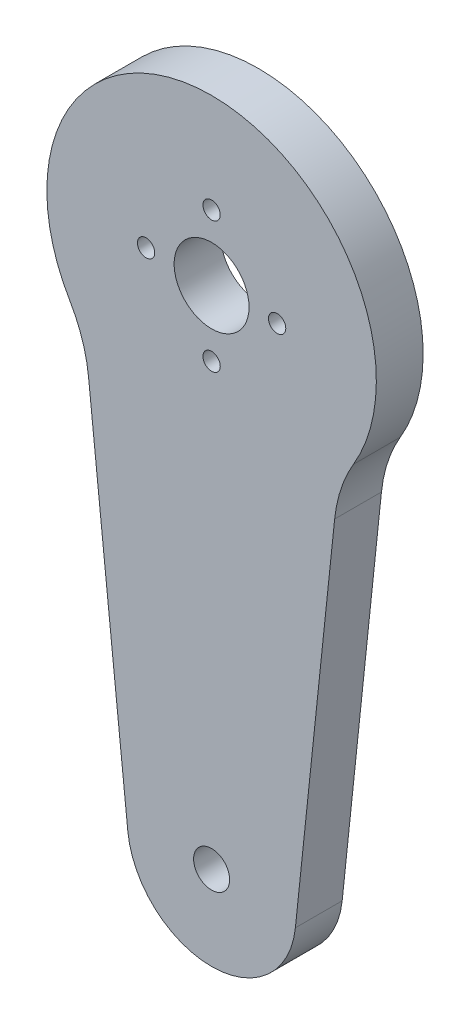
ISO-10303-21;
HEADER;
FILE_DESCRIPTION(('STEP AP214'),'2;1');
FILE_NAME('part.step','',(''),(''),'','','');
FILE_SCHEMA(('AUTOMOTIVE_DESIGN { 1 0 10303 214 1 1 1 1 }'));
ENDSEC;
DATA;
#1=APPLICATION_CONTEXT('core data for automotive mechanical design processes');
#2=APPLICATION_PROTOCOL_DEFINITION('international standard','automotive_design',2000,#1);
#3=PRODUCT_CONTEXT('',#1,'mechanical');
#4=PRODUCT('Part','Part','',(#3));
#5=PRODUCT_RELATED_PRODUCT_CATEGORY('part','',(#4));
#6=PRODUCT_DEFINITION_FORMATION('','',#4);
#7=PRODUCT_DEFINITION_CONTEXT('part definition',#1,'design');
#8=PRODUCT_DEFINITION('design','',#6,#7);
#9=PRODUCT_DEFINITION_SHAPE('','',#8);
#10=(LENGTH_UNIT() NAMED_UNIT(*) SI_UNIT(.MILLI.,.METRE.));
#11=(NAMED_UNIT(*) PLANE_ANGLE_UNIT() SI_UNIT($,.RADIAN.));
#12=(NAMED_UNIT(*) SI_UNIT($,.STERADIAN.) SOLID_ANGLE_UNIT());
#13=UNCERTAINTY_MEASURE_WITH_UNIT(LENGTH_MEASURE(1.E-05),#10,'distance_accuracy_value','');
#14=(GEOMETRIC_REPRESENTATION_CONTEXT(3) GLOBAL_UNCERTAINTY_ASSIGNED_CONTEXT((#13)) GLOBAL_UNIT_ASSIGNED_CONTEXT((#10,
#11,#12)) REPRESENTATION_CONTEXT('',''));
#15=CARTESIAN_POINT('',(0.,0.,0.));
#16=DIRECTION('',(0.,0.,1.));
#17=DIRECTION('',(1.,0.,0.));
#18=AXIS2_PLACEMENT_3D('',#15,#16,#17);
#19=CARTESIAN_POINT('',(1.49186218934005E-13,-54.0000000000009,5.));
#20=DIRECTION('',(0.,0.,1.));
#21=DIRECTION('',(1.,0.,0.));
#22=AXIS2_PLACEMENT_3D('',#19,#20,#21);
#23=PLANE('',#22);
#24=CARTESIAN_POINT('',(-7.,0.,5.));
#25=DIRECTION('',(0.,0.,1.));
#26=DIRECTION('',(1.,0.,0.));
#27=AXIS2_PLACEMENT_3D('',#24,#25,#26);
#28=CIRCLE('',#27,0.924999999999954);
#29=CARTESIAN_POINT('',(-6.07500000000005,0.,5.));
#30=VERTEX_POINT('',#29);
#31=EDGE_CURVE('E196',#30,#30,#28,.T.);
#32=ORIENTED_EDGE('',*,*,#31,.F.);
#33=EDGE_LOOP('',(#32));
#34=FACE_BOUND('',#33,.T.);
#35=CARTESIAN_POINT('',(0.,-7.,5.));
#36=DIRECTION('',(0.,0.,1.));
#37=DIRECTION('',(1.,0.,0.));
#38=AXIS2_PLACEMENT_3D('',#35,#36,#37);
#39=CIRCLE('',#38,0.924999999999767);
#40=CARTESIAN_POINT('',(0.924999999999767,-7.,5.));
#41=VERTEX_POINT('',#40);
#42=EDGE_CURVE('E208',#41,#41,#39,.T.);
#43=ORIENTED_EDGE('',*,*,#42,.F.);
#44=EDGE_LOOP('',(#43));
#45=FACE_BOUND('',#44,.T.);
#46=CARTESIAN_POINT('',(1.49186218934005E-13,-54.0000000000009,5.));
#47=DIRECTION('',(0.,0.,1.));
#48=DIRECTION('',(1.,0.,0.));
#49=AXIS2_PLACEMENT_3D('',#46,#47,#48);
#50=CIRCLE('',#49,1.92500000000007);
#51=CARTESIAN_POINT('',(1.92500000000021,-54.0000000000009,5.));
#52=VERTEX_POINT('',#51);
#53=EDGE_CURVE('E121',#52,#52,#50,.T.);
#54=ORIENTED_EDGE('',*,*,#53,.F.);
#55=EDGE_LOOP('',(#54));
#56=FACE_BOUND('',#55,.T.);
#57=CARTESIAN_POINT('',(1.49186218934005E-13,-54.0000000000009,5.));
#58=DIRECTION('',(0.,0.,1.));
#59=DIRECTION('',(1.,0.,0.));
#60=AXIS2_PLACEMENT_3D('',#57,#58,#59);
#61=CIRCLE('',#60,9.00000000000006);
#62=CARTESIAN_POINT('',(-8.95069706241821,-54.9407561303643,5.));
#63=VERTEX_POINT('',#62);
#64=CARTESIAN_POINT('',(8.95069706241851,-54.9407561303643,5.));
#65=VERTEX_POINT('',#64);
#66=EDGE_CURVE('E128',#63,#65,#61,.T.);
#67=ORIENTED_EDGE('',*,*,#66,.T.);
#68=DIRECTION('',(0.104528458929264,0.994521895824256,0.));
#69=VECTOR('',#68,1.);
#70=CARTESIAN_POINT('',(8.95069706241851,-54.9407561303643,5.));
#71=LINE('',#70,#69);
#72=CARTESIAN_POINT('',(13.1465680638311,-15.0197085448194,5.));
#73=VERTEX_POINT('',#72);
#74=EDGE_CURVE('E86',#65,#73,#71,.T.);
#75=ORIENTED_EDGE('',*,*,#74,.T.);
#76=CARTESIAN_POINT('',(28.0643965027107,-16.5876354289179,5.));
#77=DIRECTION('',(0.,0.,-1.));
#78=DIRECTION('',(1.,0.,0.));
#79=AXIS2_PLACEMENT_3D('',#76,#77,#78);
#80=CIRCLE('',#79,15.0000000015242);
#81=CARTESIAN_POINT('',(15.1513306270365,-8.95528783881032,5.));
#82=VERTEX_POINT('',#81);
#83=EDGE_CURVE('E99',#73,#82,#80,.T.);
#84=ORIENTED_EDGE('',*,*,#83,.T.);
#85=CARTESIAN_POINT('',(0.,0.,5.));
#86=DIRECTION('',(0.,0.,1.));
#87=DIRECTION('',(1.,0.,0.));
#88=AXIS2_PLACEMENT_3D('',#85,#86,#87);
#89=CIRCLE('',#88,17.6000000012988);
#90=CARTESIAN_POINT('',(-15.1513306270365,-8.95528783881033,5.));
#91=VERTEX_POINT('',#90);
#92=EDGE_CURVE('E93',#82,#91,#89,.T.);
#93=ORIENTED_EDGE('',*,*,#92,.T.);
#94=CARTESIAN_POINT('',(-28.0643965027108,-16.5876354289178,5.));
#95=DIRECTION('',(0.,0.,-1.));
#96=DIRECTION('',(1.,0.,0.));
#97=AXIS2_PLACEMENT_3D('',#94,#95,#96);
#98=CIRCLE('',#97,15.0000000015241);
#99=CARTESIAN_POINT('',(-13.1465680638312,-15.0197085448196,5.));
#100=VERTEX_POINT('',#99);
#101=EDGE_CURVE('E97',#91,#100,#98,.T.);
#102=ORIENTED_EDGE('',*,*,#101,.T.);
#103=DIRECTION('',(0.104528458929274,-0.994521895824255,0.));
#104=VECTOR('',#103,1.);
#105=CARTESIAN_POINT('',(-13.1465680638312,-15.0197085448196,5.));
#106=LINE('',#105,#104);
#107=EDGE_CURVE('E49',#100,#63,#106,.T.);
#108=ORIENTED_EDGE('',*,*,#107,.T.);
#109=EDGE_LOOP('',(#67,#75,#84,#93,#102,#108));
#110=FACE_BOUND('',#109,.T.);
#111=CARTESIAN_POINT('',(7.,0.,5.));
#112=DIRECTION('',(0.,0.,1.));
#113=DIRECTION('',(1.,0.,0.));
#114=AXIS2_PLACEMENT_3D('',#111,#112,#113);
#115=CIRCLE('',#114,0.924999999999953);
#116=CARTESIAN_POINT('',(7.92499999999995,0.,5.));
#117=VERTEX_POINT('',#116);
#118=EDGE_CURVE('E214',#117,#117,#115,.T.);
#119=ORIENTED_EDGE('',*,*,#118,.F.);
#120=EDGE_LOOP('',(#119));
#121=FACE_BOUND('',#120,.T.);
#122=CARTESIAN_POINT('',(0.,7.,5.));
#123=DIRECTION('',(0.,0.,1.));
#124=DIRECTION('',(1.,0.,0.));
#125=AXIS2_PLACEMENT_3D('',#122,#123,#124);
#126=CIRCLE('',#125,0.924999999999954);
#127=CARTESIAN_POINT('',(0.924999999999954,7.,5.));
#128=VERTEX_POINT('',#127);
#129=EDGE_CURVE('E202',#128,#128,#126,.T.);
#130=ORIENTED_EDGE('',*,*,#129,.F.);
#131=EDGE_LOOP('',(#130));
#132=FACE_BOUND('',#131,.T.);
#133=CARTESIAN_POINT('',(0.,0.,5.));
#134=DIRECTION('',(0.,0.,1.));
#135=DIRECTION('',(1.,0.,0.));
#136=AXIS2_PLACEMENT_3D('',#133,#134,#135);
#137=CIRCLE('',#136,4.);
#138=CARTESIAN_POINT('',(4.,0.,5.));
#139=VERTEX_POINT('',#138);
#140=EDGE_CURVE('E187',#139,#139,#137,.T.);
#141=ORIENTED_EDGE('',*,*,#140,.F.);
#142=EDGE_LOOP('',(#141));
#143=FACE_BOUND('',#142,.T.);
#144=ADVANCED_FACE('F32',(#34,#45,#56,#110,#121,#132,#143),#23,.T.);
#145=CARTESIAN_POINT('',(1.49186218934005E-13,-54.0000000000009,0.));
#146=DIRECTION('',(0.,0.,1.));
#147=DIRECTION('',(1.,0.,0.));
#148=AXIS2_PLACEMENT_3D('',#145,#146,#147);
#149=PLANE('',#148);
#150=CARTESIAN_POINT('',(1.49186218934005E-13,-54.0000000000009,0.));
#151=DIRECTION('',(0.,0.,1.));
#152=DIRECTION('',(1.,0.,0.));
#153=AXIS2_PLACEMENT_3D('',#150,#151,#152);
#154=CIRCLE('',#153,9.00000000000006);
#155=CARTESIAN_POINT('',(-8.95069706241821,-54.9407561303643,0.));
#156=VERTEX_POINT('',#155);
#157=CARTESIAN_POINT('',(8.95069706241851,-54.9407561303643,0.));
#158=VERTEX_POINT('',#157);
#159=EDGE_CURVE('E117',#156,#158,#154,.T.);
#160=ORIENTED_EDGE('',*,*,#159,.F.);
#161=DIRECTION('',(0.104528458929274,-0.994521895824255,0.));
#162=VECTOR('',#161,1.);
#163=CARTESIAN_POINT('',(-13.1465680638312,-15.0197085448196,0.));
#164=LINE('',#163,#162);
#165=CARTESIAN_POINT('',(-13.1465680638312,-15.0197085448196,0.));
#166=VERTEX_POINT('',#165);
#167=EDGE_CURVE('E78',#166,#156,#164,.T.);
#168=ORIENTED_EDGE('',*,*,#167,.F.);
#169=CARTESIAN_POINT('',(-28.0643965027108,-16.5876354289178,0.));
#170=DIRECTION('',(0.,0.,-1.));
#171=DIRECTION('',(1.,0.,0.));
#172=AXIS2_PLACEMENT_3D('',#169,#170,#171);
#173=CIRCLE('',#172,15.0000000015241);
#174=CARTESIAN_POINT('',(-15.1513306270365,-8.95528783881033,0.));
#175=VERTEX_POINT('',#174);
#176=EDGE_CURVE('E72',#175,#166,#173,.T.);
#177=ORIENTED_EDGE('',*,*,#176,.F.);
#178=CARTESIAN_POINT('',(0.,0.,0.));
#179=DIRECTION('',(0.,0.,1.));
#180=DIRECTION('',(1.,0.,0.));
#181=AXIS2_PLACEMENT_3D('',#178,#179,#180);
#182=CIRCLE('',#181,17.6000000012988);
#183=CARTESIAN_POINT('',(15.1513306270365,-8.95528783881032,0.));
#184=VERTEX_POINT('',#183);
#185=EDGE_CURVE('E107',#184,#175,#182,.T.);
#186=ORIENTED_EDGE('',*,*,#185,.F.);
#187=CARTESIAN_POINT('',(28.0643965027107,-16.5876354289179,0.));
#188=DIRECTION('',(0.,0.,-1.));
#189=DIRECTION('',(1.,0.,0.));
#190=AXIS2_PLACEMENT_3D('',#187,#188,#189);
#191=CIRCLE('',#190,15.0000000015242);
#192=CARTESIAN_POINT('',(13.1465680638311,-15.0197085448194,0.));
#193=VERTEX_POINT('',#192);
#194=EDGE_CURVE('E123',#193,#184,#191,.T.);
#195=ORIENTED_EDGE('',*,*,#194,.F.);
#196=DIRECTION('',(0.104528458929264,0.994521895824256,0.));
#197=VECTOR('',#196,1.);
#198=CARTESIAN_POINT('',(8.95069706241851,-54.9407561303643,0.));
#199=LINE('',#198,#197);
#200=EDGE_CURVE('E120',#158,#193,#199,.T.);
#201=ORIENTED_EDGE('',*,*,#200,.F.);
#202=EDGE_LOOP('',(#160,#168,#177,#186,#195,#201));
#203=FACE_BOUND('',#202,.T.);
#204=CARTESIAN_POINT('',(1.49186218934005E-13,-54.0000000000009,0.));
#205=DIRECTION('',(0.,0.,1.));
#206=DIRECTION('',(1.,0.,0.));
#207=AXIS2_PLACEMENT_3D('',#204,#205,#206);
#208=CIRCLE('',#207,1.92500000000007);
#209=CARTESIAN_POINT('',(1.92500000000021,-54.0000000000009,0.));
#210=VERTEX_POINT('',#209);
#211=EDGE_CURVE('E217',#210,#210,#208,.T.);
#212=ORIENTED_EDGE('',*,*,#211,.T.);
#213=EDGE_LOOP('',(#212));
#214=FACE_BOUND('',#213,.T.);
#215=CARTESIAN_POINT('',(7.,0.,0.));
#216=DIRECTION('',(0.,0.,1.));
#217=DIRECTION('',(1.,0.,0.));
#218=AXIS2_PLACEMENT_3D('',#215,#216,#217);
#219=CIRCLE('',#218,0.924999999999953);
#220=CARTESIAN_POINT('',(7.92499999999995,0.,0.));
#221=VERTEX_POINT('',#220);
#222=EDGE_CURVE('E211',#221,#221,#219,.T.);
#223=ORIENTED_EDGE('',*,*,#222,.T.);
#224=EDGE_LOOP('',(#223));
#225=FACE_BOUND('',#224,.T.);
#226=CARTESIAN_POINT('',(0.,-7.,0.));
#227=DIRECTION('',(0.,0.,1.));
#228=DIRECTION('',(1.,0.,0.));
#229=AXIS2_PLACEMENT_3D('',#226,#227,#228);
#230=CIRCLE('',#229,0.924999999999767);
#231=CARTESIAN_POINT('',(0.924999999999767,-7.,0.));
#232=VERTEX_POINT('',#231);
#233=EDGE_CURVE('E205',#232,#232,#230,.T.);
#234=ORIENTED_EDGE('',*,*,#233,.T.);
#235=EDGE_LOOP('',(#234));
#236=FACE_BOUND('',#235,.T.);
#237=CARTESIAN_POINT('',(0.,7.,0.));
#238=DIRECTION('',(0.,0.,1.));
#239=DIRECTION('',(1.,0.,0.));
#240=AXIS2_PLACEMENT_3D('',#237,#238,#239);
#241=CIRCLE('',#240,0.924999999999954);
#242=CARTESIAN_POINT('',(0.924999999999954,7.,0.));
#243=VERTEX_POINT('',#242);
#244=EDGE_CURVE('E199',#243,#243,#241,.T.);
#245=ORIENTED_EDGE('',*,*,#244,.T.);
#246=EDGE_LOOP('',(#245));
#247=FACE_BOUND('',#246,.T.);
#248=CARTESIAN_POINT('',(-7.,0.,0.));
#249=DIRECTION('',(0.,0.,1.));
#250=DIRECTION('',(1.,0.,0.));
#251=AXIS2_PLACEMENT_3D('',#248,#249,#250);
#252=CIRCLE('',#251,0.924999999999954);
#253=CARTESIAN_POINT('',(-6.07500000000005,0.,0.));
#254=VERTEX_POINT('',#253);
#255=EDGE_CURVE('E193',#254,#254,#252,.T.);
#256=ORIENTED_EDGE('',*,*,#255,.T.);
#257=EDGE_LOOP('',(#256));
#258=FACE_BOUND('',#257,.T.);
#259=CARTESIAN_POINT('',(0.,0.,0.));
#260=DIRECTION('',(0.,0.,1.));
#261=DIRECTION('',(1.,0.,0.));
#262=AXIS2_PLACEMENT_3D('',#259,#260,#261);
#263=CIRCLE('',#262,4.);
#264=CARTESIAN_POINT('',(4.,0.,0.));
#265=VERTEX_POINT('',#264);
#266=EDGE_CURVE('E190',#265,#265,#263,.T.);
#267=ORIENTED_EDGE('',*,*,#266,.T.);
#268=EDGE_LOOP('',(#267));
#269=FACE_BOUND('',#268,.T.);
#270=ADVANCED_FACE('F137',(#203,#214,#225,#236,#247,#258,#269),#149,.F.);
#271=CARTESIAN_POINT('',(1.49186218934005E-13,-54.0000000000009,5.));
#272=DIRECTION('',(0.,0.,-1.));
#273=DIRECTION('',(-1.,0.,0.));
#274=AXIS2_PLACEMENT_3D('',#271,#272,#273);
#275=CYLINDRICAL_SURFACE('',#274,9.00000000000006);
#276=ORIENTED_EDGE('',*,*,#159,.T.);
#277=DIRECTION('',(0.,0.,-1.));
#278=VECTOR('',#277,1.);
#279=CARTESIAN_POINT('',(8.95069706241851,-54.9407561303643,5.));
#280=LINE('',#279,#278);
#281=EDGE_CURVE('E11',#65,#158,#280,.T.);
#282=ORIENTED_EDGE('',*,*,#281,.F.);
#283=ORIENTED_EDGE('',*,*,#66,.F.);
#284=DIRECTION('',(0.,0.,-1.));
#285=VECTOR('',#284,1.);
#286=CARTESIAN_POINT('',(-8.95069706241821,-54.9407561303643,5.));
#287=LINE('',#286,#285);
#288=EDGE_CURVE('E113',#63,#156,#287,.T.);
#289=ORIENTED_EDGE('',*,*,#288,.T.);
#290=EDGE_LOOP('',(#276,#282,#283,#289));
#291=FACE_BOUND('',#290,.T.);
#292=ADVANCED_FACE('F34',(#291),#275,.T.);
#293=CARTESIAN_POINT('',(8.95069706241851,-54.9407561303643,5.));
#294=DIRECTION('',(-0.994521895824256,0.104528458929264,0.));
#295=DIRECTION('',(-0.104528458929264,-0.994521895824256,0.));
#296=AXIS2_PLACEMENT_3D('',#293,#294,#295);
#297=PLANE('',#296);
#298=ORIENTED_EDGE('',*,*,#200,.T.);
#299=DIRECTION('',(0.,0.,-1.));
#300=VECTOR('',#299,1.);
#301=CARTESIAN_POINT('',(13.1465680638311,-15.0197085448194,5.));
#302=LINE('',#301,#300);
#303=EDGE_CURVE('E41',#73,#193,#302,.T.);
#304=ORIENTED_EDGE('',*,*,#303,.F.);
#305=ORIENTED_EDGE('',*,*,#74,.F.);
#306=ORIENTED_EDGE('',*,*,#281,.T.);
#307=EDGE_LOOP('',(#298,#304,#305,#306));
#308=FACE_BOUND('',#307,.T.);
#309=ADVANCED_FACE('F293',(#308),#297,.F.);
#310=CARTESIAN_POINT('',(28.0643965027107,-16.5876354289179,5.));
#311=DIRECTION('',(0.,0.,-1.));
#312=DIRECTION('',(-1.,0.,0.));
#313=AXIS2_PLACEMENT_3D('',#310,#311,#312);
#314=CYLINDRICAL_SURFACE('',#313,15.0000000015242);
#315=ORIENTED_EDGE('',*,*,#194,.T.);
#316=DIRECTION('',(0.,0.,-1.));
#317=VECTOR('',#316,1.);
#318=CARTESIAN_POINT('',(15.1513306270365,-8.95528783881032,5.));
#319=LINE('',#318,#317);
#320=EDGE_CURVE('E108',#82,#184,#319,.T.);
#321=ORIENTED_EDGE('',*,*,#320,.F.);
#322=ORIENTED_EDGE('',*,*,#83,.F.);
#323=ORIENTED_EDGE('',*,*,#303,.T.);
#324=EDGE_LOOP('',(#315,#321,#322,#323));
#325=FACE_BOUND('',#324,.T.);
#326=ADVANCED_FACE('F134',(#325),#314,.F.);
#327=CARTESIAN_POINT('',(0.,0.,5.));
#328=DIRECTION('',(0.,0.,-1.));
#329=DIRECTION('',(-1.,0.,0.));
#330=AXIS2_PLACEMENT_3D('',#327,#328,#329);
#331=CYLINDRICAL_SURFACE('',#330,17.6000000012988);
#332=ORIENTED_EDGE('',*,*,#185,.T.);
#333=DIRECTION('',(0.,0.,-1.));
#334=VECTOR('',#333,1.);
#335=CARTESIAN_POINT('',(-15.1513306270365,-8.95528783881033,5.));
#336=LINE('',#335,#334);
#337=EDGE_CURVE('E104',#91,#175,#336,.T.);
#338=ORIENTED_EDGE('',*,*,#337,.F.);
#339=ORIENTED_EDGE('',*,*,#92,.F.);
#340=ORIENTED_EDGE('',*,*,#320,.T.);
#341=EDGE_LOOP('',(#332,#338,#339,#340));
#342=FACE_BOUND('',#341,.T.);
#343=ADVANCED_FACE('F105',(#342),#331,.T.);
#344=CARTESIAN_POINT('',(-28.0643965027108,-16.5876354289178,5.));
#345=DIRECTION('',(0.,0.,-1.));
#346=DIRECTION('',(-1.,0.,0.));
#347=AXIS2_PLACEMENT_3D('',#344,#345,#346);
#348=CYLINDRICAL_SURFACE('',#347,15.0000000015241);
#349=ORIENTED_EDGE('',*,*,#176,.T.);
#350=DIRECTION('',(0.,0.,-1.));
#351=VECTOR('',#350,1.);
#352=CARTESIAN_POINT('',(-13.1465680638312,-15.0197085448196,5.));
#353=LINE('',#352,#351);
#354=EDGE_CURVE('E109',#100,#166,#353,.T.);
#355=ORIENTED_EDGE('',*,*,#354,.F.);
#356=ORIENTED_EDGE('',*,*,#101,.F.);
#357=ORIENTED_EDGE('',*,*,#337,.T.);
#358=EDGE_LOOP('',(#349,#355,#356,#357));
#359=FACE_BOUND('',#358,.T.);
#360=ADVANCED_FACE('F111',(#359),#348,.F.);
#361=CARTESIAN_POINT('',(-13.1465680638312,-15.0197085448196,5.));
#362=DIRECTION('',(0.994521895824255,0.104528458929275,0.));
#363=DIRECTION('',(-0.104528458929275,0.994521895824256,0.));
#364=AXIS2_PLACEMENT_3D('',#361,#362,#363);
#365=PLANE('',#364);
#366=ORIENTED_EDGE('',*,*,#167,.T.);
#367=ORIENTED_EDGE('',*,*,#288,.F.);
#368=ORIENTED_EDGE('',*,*,#107,.F.);
#369=ORIENTED_EDGE('',*,*,#354,.T.);
#370=EDGE_LOOP('',(#366,#367,#368,#369));
#371=FACE_BOUND('',#370,.T.);
#372=ADVANCED_FACE('F142',(#371),#365,.F.);
#373=CARTESIAN_POINT('',(1.49186218934005E-13,-54.0000000000009,5.));
#374=DIRECTION('',(0.,0.,-1.));
#375=DIRECTION('',(-1.,0.,0.));
#376=AXIS2_PLACEMENT_3D('',#373,#374,#375);
#377=CYLINDRICAL_SURFACE('',#376,1.92500000000007);
#378=ORIENTED_EDGE('',*,*,#53,.T.);
#379=EDGE_LOOP('',(#378));
#380=FACE_BOUND('',#379,.T.);
#381=ORIENTED_EDGE('',*,*,#211,.F.);
#382=EDGE_LOOP('',(#381));
#383=FACE_BOUND('',#382,.T.);
#384=ADVANCED_FACE('F144',(#380,#383),#377,.F.);
#385=CARTESIAN_POINT('',(7.,0.,5.));
#386=DIRECTION('',(0.,0.,-1.));
#387=DIRECTION('',(-1.,0.,0.));
#388=AXIS2_PLACEMENT_3D('',#385,#386,#387);
#389=CYLINDRICAL_SURFACE('',#388,0.924999999999953);
#390=ORIENTED_EDGE('',*,*,#118,.T.);
#391=EDGE_LOOP('',(#390));
#392=FACE_BOUND('',#391,.T.);
#393=ORIENTED_EDGE('',*,*,#222,.F.);
#394=EDGE_LOOP('',(#393));
#395=FACE_BOUND('',#394,.T.);
#396=ADVANCED_FACE('F150',(#392,#395),#389,.F.);
#397=CARTESIAN_POINT('',(0.,-7.,5.));
#398=DIRECTION('',(0.,0.,-1.));
#399=DIRECTION('',(-1.,0.,0.));
#400=AXIS2_PLACEMENT_3D('',#397,#398,#399);
#401=CYLINDRICAL_SURFACE('',#400,0.924999999999767);
#402=ORIENTED_EDGE('',*,*,#42,.T.);
#403=EDGE_LOOP('',(#402));
#404=FACE_BOUND('',#403,.T.);
#405=ORIENTED_EDGE('',*,*,#233,.F.);
#406=EDGE_LOOP('',(#405));
#407=FACE_BOUND('',#406,.T.);
#408=ADVANCED_FACE('F166',(#404,#407),#401,.F.);
#409=CARTESIAN_POINT('',(0.,7.,5.));
#410=DIRECTION('',(0.,0.,-1.));
#411=DIRECTION('',(-1.,0.,0.));
#412=AXIS2_PLACEMENT_3D('',#409,#410,#411);
#413=CYLINDRICAL_SURFACE('',#412,0.924999999999954);
#414=ORIENTED_EDGE('',*,*,#129,.T.);
#415=EDGE_LOOP('',(#414));
#416=FACE_BOUND('',#415,.T.);
#417=ORIENTED_EDGE('',*,*,#244,.F.);
#418=EDGE_LOOP('',(#417));
#419=FACE_BOUND('',#418,.T.);
#420=ADVANCED_FACE('F170',(#416,#419),#413,.F.);
#421=CARTESIAN_POINT('',(-7.,0.,5.));
#422=DIRECTION('',(0.,0.,-1.));
#423=DIRECTION('',(-1.,0.,0.));
#424=AXIS2_PLACEMENT_3D('',#421,#422,#423);
#425=CYLINDRICAL_SURFACE('',#424,0.924999999999954);
#426=ORIENTED_EDGE('',*,*,#31,.T.);
#427=EDGE_LOOP('',(#426));
#428=FACE_BOUND('',#427,.T.);
#429=ORIENTED_EDGE('',*,*,#255,.F.);
#430=EDGE_LOOP('',(#429));
#431=FACE_BOUND('',#430,.T.);
#432=ADVANCED_FACE('F174',(#428,#431),#425,.F.);
#433=CARTESIAN_POINT('',(0.,0.,5.));
#434=DIRECTION('',(0.,0.,-1.));
#435=DIRECTION('',(-1.,0.,0.));
#436=AXIS2_PLACEMENT_3D('',#433,#434,#435);
#437=CYLINDRICAL_SURFACE('',#436,4.);
#438=ORIENTED_EDGE('',*,*,#140,.T.);
#439=EDGE_LOOP('',(#438));
#440=FACE_BOUND('',#439,.T.);
#441=ORIENTED_EDGE('',*,*,#266,.F.);
#442=EDGE_LOOP('',(#441));
#443=FACE_BOUND('',#442,.T.);
#444=ADVANCED_FACE('F178',(#440,#443),#437,.F.);
#445=CLOSED_SHELL('',(#144,#270,#292,#309,#326,#343,#360,#372,#384,#396,#408,#420,#432,#444));
#446=MANIFOLD_SOLID_BREP('B2',#445);
#447=ADVANCED_BREP_SHAPE_REPRESENTATION('',(#18,#446),#14);
#448=SHAPE_DEFINITION_REPRESENTATION(#9,#447);
ENDSEC;
END-ISO-10303-21;
